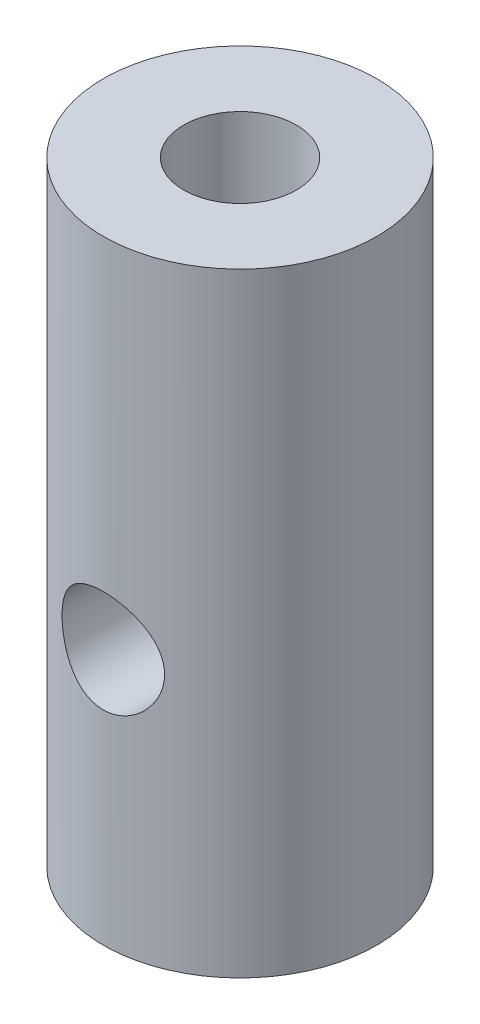
ISO-10303-21;
HEADER;
FILE_DESCRIPTION(('STEP AP214'),'2;1');
FILE_NAME('part.step','',(''),(''),'','','');
FILE_SCHEMA(('AUTOMOTIVE_DESIGN { 1 0 10303 214 1 1 1 1 }'));
ENDSEC;
DATA;
#1=APPLICATION_CONTEXT('core data for automotive mechanical design processes');
#2=APPLICATION_PROTOCOL_DEFINITION('international standard','automotive_design',2000,#1);
#3=PRODUCT_CONTEXT('',#1,'mechanical');
#4=PRODUCT('Part','Part','',(#3));
#5=PRODUCT_RELATED_PRODUCT_CATEGORY('part','',(#4));
#6=PRODUCT_DEFINITION_FORMATION('','',#4);
#7=PRODUCT_DEFINITION_CONTEXT('part definition',#1,'design');
#8=PRODUCT_DEFINITION('design','',#6,#7);
#9=PRODUCT_DEFINITION_SHAPE('','',#8);
#10=(LENGTH_UNIT() NAMED_UNIT(*) SI_UNIT(.MILLI.,.METRE.));
#11=(NAMED_UNIT(*) PLANE_ANGLE_UNIT() SI_UNIT($,.RADIAN.));
#12=(NAMED_UNIT(*) SI_UNIT($,.STERADIAN.) SOLID_ANGLE_UNIT());
#13=UNCERTAINTY_MEASURE_WITH_UNIT(LENGTH_MEASURE(1.E-05),#10,'distance_accuracy_value','');
#14=(GEOMETRIC_REPRESENTATION_CONTEXT(3) GLOBAL_UNCERTAINTY_ASSIGNED_CONTEXT((#13)) GLOBAL_UNIT_ASSIGNED_CONTEXT((#10,
#11,#12)) REPRESENTATION_CONTEXT('',''));
#15=CARTESIAN_POINT('',(0.,0.,0.));
#16=DIRECTION('',(0.,0.,1.));
#17=DIRECTION('',(1.,0.,0.));
#18=AXIS2_PLACEMENT_3D('',#15,#16,#17);
#19=CARTESIAN_POINT('',(0.,29.2787083669848,0.));
#20=DIRECTION('',(0.,-1.,0.));
#21=DIRECTION('',(0.,0.,-1.));
#22=AXIS2_PLACEMENT_3D('',#19,#20,#21);
#23=CYLINDRICAL_SURFACE('',#22,4.);
#24=CARTESIAN_POINT('',(0.,8.96500003999999,-4.));
#25=CARTESIAN_POINT('',(0.0812350589378522,8.9650029423031,-4.00000217456151));
#26=CARTESIAN_POINT('',(0.162450241781791,8.95838027975161,-3.99750379283184));
#27=CARTESIAN_POINT('',(0.322453452352359,8.93217184473006,-3.98778696006928));
#28=CARTESIAN_POINT('',(0.401241827987613,8.91258793952943,-3.98056918893993));
#29=CARTESIAN_POINT('',(0.554060784990875,8.86124703822823,-3.96218832391545));
#30=CARTESIAN_POINT('',(0.628100224162273,8.82951352317821,-3.9510328434944));
#31=CARTESIAN_POINT('',(0.769799310160249,8.75489362698417,-3.92588767765353));
#32=CARTESIAN_POINT('',(0.837457239177874,8.71200425445584,-3.91189723227548));
#33=CARTESIAN_POINT('',(0.96734641704582,8.61438750892909,-3.88186246971217));
#34=CARTESIAN_POINT('',(1.02927073015119,8.5592697777406,-3.86576002583566));
#35=CARTESIAN_POINT('',(1.14324421474363,8.43958960534116,-3.83360220871327));
#36=CARTESIAN_POINT('',(1.19529036359202,8.37502428391213,-3.81754685135033));
#37=CARTESIAN_POINT('',(1.28998202215984,8.23528257247679,-3.78662470617732));
#38=CARTESIAN_POINT('',(1.33219393195759,8.15979567345418,-3.77182648820819));
#39=CARTESIAN_POINT('',(1.40318646334084,8.00215168583148,-3.74599860237434));
#40=CARTESIAN_POINT('',(1.43197244961238,7.9199972768449,-3.73496742975881));
#41=CARTESIAN_POINT('',(1.47408431017549,7.7548832997418,-3.71854412824136));
#42=CARTESIAN_POINT('',(1.48799593218557,7.67209500156456,-3.71293924350838));
#43=CARTESIAN_POINT('',(1.50179556531647,7.50518388200616,-3.70738061461215));
#44=CARTESIAN_POINT('',(1.5016893680263,7.42106162612554,-3.70742453659305));
#45=CARTESIAN_POINT('',(1.48790429610018,7.25923051478705,-3.71297511632055));
#46=CARTESIAN_POINT('',(1.47503808509003,7.18143913395583,-3.71815468871122));
#47=CARTESIAN_POINT('',(1.4374416786833,7.02921288959469,-3.7328493805953));
#48=CARTESIAN_POINT('',(1.41270969663258,6.95477853338613,-3.74236515298863));
#49=CARTESIAN_POINT('',(1.35163748571904,6.80972297227178,-3.76485702190253));
#50=CARTESIAN_POINT('',(1.315086487371,6.73920055387871,-3.77789517988166));
#51=CARTESIAN_POINT('',(1.23156073762698,6.60505430240904,-3.80594210139319));
#52=CARTESIAN_POINT('',(1.18458238728897,6.54143286248031,-3.82095154457158));
#53=CARTESIAN_POINT('',(1.07781780766549,6.41839637634914,-3.85248038859113));
#54=CARTESIAN_POINT('',(1.01738298716956,6.35955139925192,-3.8690334745567));
#55=CARTESIAN_POINT('',(0.887312590819025,6.25266207379422,-3.90091728164085));
#56=CARTESIAN_POINT('',(0.817675603497369,6.20461938539434,-3.91624781465952));
#57=CARTESIAN_POINT('',(0.669723436992426,6.12006964293749,-3.9442639480908));
#58=CARTESIAN_POINT('',(0.591290713844726,6.08375245877895,-3.95690498259616));
#59=CARTESIAN_POINT('',(0.428836850524591,6.02501743572997,-3.97778718326962));
#60=CARTESIAN_POINT('',(0.344818210845776,6.0025934234389,-3.98603030341493));
#61=CARTESIAN_POINT('',(0.178375243148675,5.97337725245808,-3.99684443228065));
#62=CARTESIAN_POINT('',(0.0961036195622195,5.9658174336175,-3.99969369025686));
#63=CARTESIAN_POINT('',(-0.0685724752550129,5.96430897610009,-4.00025893700126));
#64=CARTESIAN_POINT('',(-0.150976912983361,5.97035731968324,-3.99797606386863));
#65=CARTESIAN_POINT('',(-0.310262048561847,5.99531008230868,-3.98871709772643));
#66=CARTESIAN_POINT('',(-0.387233328007323,6.0137115837371,-3.98192470962305));
#67=CARTESIAN_POINT('',(-0.536941754957207,6.06218611254733,-3.96451477091717));
#68=CARTESIAN_POINT('',(-0.60967835034752,6.09226065794805,-3.9538967228203));
#69=CARTESIAN_POINT('',(-0.751247765110141,6.16418645243948,-3.92949624407682));
#70=CARTESIAN_POINT('',(-0.81990308355778,6.20635776922339,-3.91563000209349));
#71=CARTESIAN_POINT('',(-0.94939271172661,6.30091814317157,-3.88626671564664));
#72=CARTESIAN_POINT('',(-1.01022412027043,6.35331097254516,-3.87076907009516));
#73=CARTESIAN_POINT('',(-1.12603079874453,6.47040416212428,-3.8387332949099));
#74=CARTESIAN_POINT('',(-1.18046154123567,6.5356422227727,-3.8221869650373));
#75=CARTESIAN_POINT('',(-1.27771050031902,6.67465142470766,-3.79078815746854));
#76=CARTESIAN_POINT('',(-1.32052767414517,6.7484233313885,-3.775935831944));
#77=CARTESIAN_POINT('',(-1.39337773518996,6.90301602677232,-3.74966829822464));
#78=CARTESIAN_POINT('',(-1.42335685446916,6.98386478591044,-3.73826760328494));
#79=CARTESIAN_POINT('',(-1.46907883466887,7.15000980368782,-3.72054032891006));
#80=CARTESIAN_POINT('',(-1.48483050305533,7.23530327619812,-3.71421061057491));
#81=CARTESIAN_POINT('',(-1.50086347097837,7.40201619954111,-3.70775894792574));
#82=CARTESIAN_POINT('',(-1.50207331495836,7.48333267171688,-3.70726444523342));
#83=CARTESIAN_POINT('',(-1.49136715641591,7.64494535627616,-3.71158412745293));
#84=CARTESIAN_POINT('',(-1.47945239850122,7.72524166467158,-3.71639780898899));
#85=CARTESIAN_POINT('',(-1.4435581563024,7.88004726671655,-3.73048141585433));
#86=CARTESIAN_POINT('',(-1.41995798316523,7.95465838624534,-3.73961085376664));
#87=CARTESIAN_POINT('',(-1.36169696779918,8.09890554849441,-3.76121548297845));
#88=CARTESIAN_POINT('',(-1.32703332944943,8.16854032807013,-3.77369151995215));
#89=CARTESIAN_POINT('',(-1.24552075938152,8.30482682969762,-3.80139723903965));
#90=CARTESIAN_POINT('',(-1.19812832803009,8.3711308367999,-3.81673698440965));
#91=CARTESIAN_POINT('',(-1.09334485729905,8.4951416009712,-3.84806246757178));
#92=CARTESIAN_POINT('',(-1.03595064012807,8.55284561478675,-3.86404840943145));
#93=CARTESIAN_POINT('',(-0.909080396784612,8.66120199582183,-3.89590424609881));
#94=CARTESIAN_POINT('',(-0.839118644212982,8.71130379343466,-3.91172104900645));
#95=CARTESIAN_POINT('',(-0.691213223200812,8.79902269527655,-3.94054514457031));
#96=CARTESIAN_POINT('',(-0.613268934090613,8.83663882773636,-3.95355221851559));
#97=CARTESIAN_POINT('',(-0.447999082002306,8.89937686904832,-3.9757429260668));
#98=CARTESIAN_POINT('',(-0.360413422234203,8.92388710460189,-3.98473657158356));
#99=CARTESIAN_POINT('',(-0.18187573360638,8.95669299992067,-3.99686242179587));
#100=CARTESIAN_POINT('',(-0.0909254163648577,8.96499679148731,-3.99999756603967));
#101=CARTESIAN_POINT('',(0.,8.96500003999999,-4.));
#102=B_SPLINE_CURVE_WITH_KNOTS('',3,(#24,#25,#26,#27,#28,#29,#30,#31,#32,#33,#34,#35,#36,#37,
#38,#39,#40,#41,#42,#43,#44,#45,#46,#47,#48,#49,#50,#51,#52,#53,#54,#55,#56,#57,#58,#59,#60,#61,
#62,#63,#64,#65,#66,#67,#68,#69,#70,#71,#72,#73,#74,#75,#76,#77,#78,#79,#80,#81,#82,#83,#84,#85,
#86,#87,#88,#89,#90,#91,#92,#93,#94,#95,#96,#97,#98,#99,#100,#101),.UNSPECIFIED.,.T.,.F.,(4,2,2,
2,2,2,2,2,2,2,2,2,2,2,2,2,2,2,2,2,2,2,2,2,2,2,2,2,2,2,2,2,2,2,2,2,2,2,4),(0.,0.243369801560558,
0.486704549530457,0.729571369213568,0.972503379609483,1.22473618582715,1.47704604925621,
1.73896674501657,2.00078269352132,2.251858744169,2.50283106079705,2.73878345119969,
2.97477138060587,3.21522408387016,3.45575990744256,3.7124615333581,3.96920257905063,
4.22991375286072,4.49050899698842,4.73725019635922,4.98393668390517,5.22114437923836,
5.4583829325445,5.70259221859596,5.94689180019864,6.20536519455653,6.46386178920136,
6.72343066727199,6.98283874956502,7.22558763480247,7.46831350211253,7.70363142426528,
7.93900886656501,8.18672471884265,8.43451941997056,8.69572329654033,8.95694749805095,
9.22948515032035,9.5018860179612),.UNSPECIFIED.);
#103=CARTESIAN_POINT('',(0.,8.96500003999999,-4.));
#104=VERTEX_POINT('',#103);
#105=EDGE_CURVE('E43',#104,#104,#102,.T.);
#106=ORIENTED_EDGE('',*,*,#105,.F.);
#107=EDGE_LOOP('',(#106));
#108=FACE_BOUND('',#107,.T.);
#109=CARTESIAN_POINT('',(1.5,7.46500004,3.70809924354783));
#110=CARTESIAN_POINT('',(1.50000304106109,7.54600752372079,3.70809640633806));
#111=CARTESIAN_POINT('',(1.49341597549487,7.62699496250364,3.71078260240986));
#112=CARTESIAN_POINT('',(1.46736187895467,7.7865281229132,3.72116159304967));
#113=CARTESIAN_POINT('',(1.44789523373263,7.86507391759501,3.72885423767112));
#114=CARTESIAN_POINT('',(1.39689657610573,8.01737541161352,3.748254802809));
#115=CARTESIAN_POINT('',(1.36539347266348,8.09114209665108,3.7599530956926));
#116=CARTESIAN_POINT('',(1.29131856742697,8.23237193681884,3.78603134206598));
#117=CARTESIAN_POINT('',(1.24874344095038,8.29983319028252,3.80041210067323));
#118=CARTESIAN_POINT('',(1.15146661374162,8.42989035162281,3.83103574665713));
#119=CARTESIAN_POINT('',(1.09630381213306,8.49212856962939,3.84733341923604));
#120=CARTESIAN_POINT('',(0.976395839778924,8.60672285467148,3.87949750628547));
#121=CARTESIAN_POINT('',(0.911648630256679,8.65907681374185,3.89536382814785));
#122=CARTESIAN_POINT('',(0.7716946551776,8.75413955229561,3.92552873936553));
#123=CARTESIAN_POINT('',(0.696206947538028,8.79645951471585,3.93975561223505));
#124=CARTESIAN_POINT('',(0.538555771965248,8.8676512125249,3.96438007973848));
#125=CARTESIAN_POINT('',(0.456394630933537,8.89652761199197,3.97477900217006));
#126=CARTESIAN_POINT('',(0.291489341676834,8.93875793577461,3.9901869710344));
#127=CARTESIAN_POINT('',(0.208923197281599,8.95272766744045,3.99540915214774));
#128=CARTESIAN_POINT('',(0.0424643637947895,8.96672124094498,4.0006401410794));
#129=CARTESIAN_POINT('',(-0.0414278850628287,8.9667496176187,4.00065064414902));
#130=CARTESIAN_POINT('',(-0.20374354306447,8.95321827853482,3.99559265903894));
#131=CARTESIAN_POINT('',(-0.282232178266893,8.94033074205118,3.99077541996683));
#132=CARTESIAN_POINT('',(-0.435839217984384,8.90246412477444,3.97693274932263));
#133=CARTESIAN_POINT('',(-0.510957383430291,8.87748418773795,3.96790701975578));
#134=CARTESIAN_POINT('',(-0.656989017303096,8.81582958832415,3.94637769167531));
#135=CARTESIAN_POINT('',(-0.7278253922873,8.77899003473158,3.93382539470077));
#136=CARTESIAN_POINT('',(-0.862486607957549,8.6948079430706,3.90651310225279));
#137=CARTESIAN_POINT('',(-0.926309176932312,8.64746201698239,3.8917523951284));
#138=CARTESIAN_POINT('',(-1.04909048680092,8.54037275371681,3.86052529655817));
#139=CARTESIAN_POINT('',(-1.10754614526347,8.48006612434957,3.84400963763883));
#140=CARTESIAN_POINT('',(-1.21370395569341,8.35040704667843,3.81182460645722));
#141=CARTESIAN_POINT('',(-1.26140340692898,8.28105233341335,3.79615544748848));
#142=CARTESIAN_POINT('',(-1.3456561180815,8.13328057253717,3.76712703500336));
#143=CARTESIAN_POINT('',(-1.38193847851829,8.05469654631393,3.75382677150277));
#144=CARTESIAN_POINT('',(-1.440564644415,7.89190381483242,3.73172438629003));
#145=CARTESIAN_POINT('',(-1.46291620605593,7.80769826840631,3.72291976205784));
#146=CARTESIAN_POINT('',(-1.49190191709667,7.64102407768404,3.71139597222849));
#147=CARTESIAN_POINT('',(-1.49933521158964,7.55871593446386,3.70836785241538));
#148=CARTESIAN_POINT('',(-1.5005788563627,7.39399068325826,3.70786539525016));
#149=CARTESIAN_POINT('',(-1.4943926109376,7.31157360764753,3.71038967003987));
#150=CARTESIAN_POINT('',(-1.46929733520155,7.15307011771232,3.72039381629736));
#151=CARTESIAN_POINT('',(-1.45100618334223,7.07686890423534,3.72763276216449));
#152=CARTESIAN_POINT('',(-1.40299774640636,6.92865209527981,3.74596487046362));
#153=CARTESIAN_POINT('',(-1.37327812034621,6.85663736083187,3.75705882250173));
#154=CARTESIAN_POINT('',(-1.30200292275276,6.7158356019238,3.7823624311608));
#155=CARTESIAN_POINT('',(-1.26004545177045,6.64727074786267,3.79667328892066));
#156=CARTESIAN_POINT('',(-1.16591317862477,6.51787105827397,3.82662814294292));
#157=CARTESIAN_POINT('',(-1.11373463696433,6.45703906537537,3.84227262594077));
#158=CARTESIAN_POINT('',(-0.996727340900921,6.34083166680491,3.87433046553184));
#159=CARTESIAN_POINT('',(-0.931306341491045,6.28604663123126,3.89072969357028));
#160=CARTESIAN_POINT('',(-0.791797471753135,6.18816167241057,3.92149874963302));
#161=CARTESIAN_POINT('',(-0.717709573322658,6.14506178705417,3.93586857107664));
#162=CARTESIAN_POINT('',(-0.563016329468463,6.0720539838004,3.96094985704552));
#163=CARTESIAN_POINT('',(-0.482434433064614,6.04210091620741,3.9716738133801));
#164=CARTESIAN_POINT('',(-0.316881887523243,5.99634362615009,3.98829436712571));
#165=CARTESIAN_POINT('',(-0.231913320723582,5.98053275457761,3.99419323299413));
#166=CARTESIAN_POINT('',(-0.0653355852738057,5.96422563724519,4.00028407317073));
#167=CARTESIAN_POINT('',(0.0161807680608545,5.96289055694102,4.00078860953764));
#168=CARTESIAN_POINT('',(0.178226786412432,5.97341519944541,3.99684889809223));
#169=CARTESIAN_POINT('',(0.258756569245264,5.98527333088587,3.9924052471313));
#170=CARTESIAN_POINT('',(0.414548248377132,6.02125889149363,3.97921089603771));
#171=CARTESIAN_POINT('',(0.48989073106884,6.04507994587837,3.97056791378017));
#172=CARTESIAN_POINT('',(0.635515473006394,6.10401005338438,3.9498778362099));
#173=CARTESIAN_POINT('',(0.705796771275547,6.13912124330477,3.93783009655664));
#174=CARTESIAN_POINT('',(0.842540176994416,6.22131398350482,3.91090618300074));
#175=CARTESIAN_POINT('',(0.908717548846852,6.26883668051416,3.89593240108828));
#176=CARTESIAN_POINT('',(1.03241734752336,6.37380787018762,3.86499507694844));
#177=CARTESIAN_POINT('',(1.0899366712559,6.43125990580789,3.84903118274027));
#178=CARTESIAN_POINT('',(1.19781214236196,6.55806417164507,3.81688129739175));
#179=CARTESIAN_POINT('',(1.24762999816025,6.62788444215432,3.8007280534916));
#180=CARTESIAN_POINT('',(1.33484709556843,6.77541590957334,3.77098325003638));
#181=CARTESIAN_POINT('',(1.37224504878157,6.85312792405349,3.75739195631217));
#182=CARTESIAN_POINT('',(1.4346588697426,7.01795572097541,3.73402269853266));
#183=CARTESIAN_POINT('',(1.45906002899522,7.10533440651179,3.7244380329086));
#184=CARTESIAN_POINT('',(1.49172356722079,7.28348531195579,3.71147994336316));
#185=CARTESIAN_POINT('',(1.4999965933957,7.37425525271,3.70810242179736));
#186=CARTESIAN_POINT('',(1.5,7.46500004,3.70809924354783));
#187=B_SPLINE_CURVE_WITH_KNOTS('',3,(#109,#110,#111,#112,#113,#114,#115,#116,#117,#118,#119,
#120,#121,#122,#123,#124,#125,#126,#127,#128,#129,#130,#131,#132,#133,#134,#135,#136,#137,#138,
#139,#140,#141,#142,#143,#144,#145,#146,#147,#148,#149,#150,#151,#152,#153,#154,#155,#156,#157,
#158,#159,#160,#161,#162,#163,#164,#165,#166,#167,#168,#169,#170,#171,#172,#173,#174,#175,#176,
#177,#178,#179,#180,#181,#182,#183,#184,#185,#186),.UNSPECIFIED.,.T.,.F.,(4,2,2,2,2,2,2,2,2,2,2,
2,2,2,2,2,2,2,2,2,2,2,2,2,2,2,2,2,2,2,2,2,2,2,2,2,2,2,4),(0.,0.242684541416168,
0.485361814598851,0.727459856757024,0.969630679682928,1.22274652401127,1.47591628822982,
1.7377007213642,1.99939426381329,2.24980018489678,2.50012465404856,2.73806472803192,
2.97602165263333,3.21744131210666,3.45893893628973,3.71456675065872,3.97025867827332,
4.23162592252963,4.49284751635471,4.73965657740482,4.98640395388881,5.22143845928195,
5.45652113429522,5.70041561005817,5.94439948466351,6.2038501699362,6.46330169650173,
6.72185508890164,6.98028685560122,7.22365720549931,7.46699820319474,7.70440274003885,
7.94185223512825,8.18928323676981,8.43680270894959,8.69738599542073,8.95799630544236,
9.2300317887092,9.50188762323046),.UNSPECIFIED.);
#188=CARTESIAN_POINT('',(1.5,7.46500004,3.70809924354783));
#189=VERTEX_POINT('',#188);
#190=EDGE_CURVE('E11',#189,#189,#187,.T.);
#191=ORIENTED_EDGE('',*,*,#190,.F.);
#192=EDGE_LOOP('',(#191));
#193=FACE_BOUND('',#192,.T.);
#194=CARTESIAN_POINT('',(0.,17.964999868,0.));
#195=DIRECTION('',(0.,-1.,0.));
#196=DIRECTION('',(0.,0.,-1.));
#197=AXIS2_PLACEMENT_3D('',#194,#195,#196);
#198=CIRCLE('',#197,4.);
#199=CARTESIAN_POINT('',(0.,17.964999868,-4.));
#200=VERTEX_POINT('',#199);
#201=EDGE_CURVE('E50',#200,#200,#198,.F.);
#202=ORIENTED_EDGE('',*,*,#201,.F.);
#203=EDGE_LOOP('',(#202));
#204=FACE_BOUND('',#203,.T.);
#205=CARTESIAN_POINT('',(0.,0.,0.));
#206=DIRECTION('',(0.,-1.,0.));
#207=DIRECTION('',(0.,0.,-1.));
#208=AXIS2_PLACEMENT_3D('',#205,#206,#207);
#209=CIRCLE('',#208,4.);
#210=CARTESIAN_POINT('',(0.,0.,-4.));
#211=VERTEX_POINT('',#210);
#212=EDGE_CURVE('E66',#211,#211,#209,.T.);
#213=ORIENTED_EDGE('',*,*,#212,.F.);
#214=EDGE_LOOP('',(#213));
#215=FACE_BOUND('',#214,.T.);
#216=ADVANCED_FACE('F39',(#108,#193,#204,#215),#23,.T.);
#217=CARTESIAN_POINT('',(0.,0.,0.));
#218=DIRECTION('',(0.,-1.,0.));
#219=DIRECTION('',(0.,0.,-1.));
#220=AXIS2_PLACEMENT_3D('',#217,#218,#219);
#221=PLANE('',#220);
#222=ORIENTED_EDGE('',*,*,#212,.T.);
#223=EDGE_LOOP('',(#222));
#224=FACE_BOUND('',#223,.T.);
#225=ADVANCED_FACE('F83',(#224),#221,.T.);
#226=CARTESIAN_POINT('',(0.,17.964999868,0.));
#227=DIRECTION('',(0.,-1.,0.));
#228=DIRECTION('',(1.,0.,0.));
#229=AXIS2_PLACEMENT_3D('',#226,#227,#228);
#230=PLANE('',#229);
#231=CARTESIAN_POINT('',(0.,17.964999868,0.));
#232=DIRECTION('',(0.,1.,0.));
#233=DIRECTION('',(0.,0.,1.));
#234=AXIS2_PLACEMENT_3D('',#231,#232,#233);
#235=CIRCLE('',#234,1.64999999999999);
#236=CARTESIAN_POINT('',(0.,17.964999868,1.64999999999999));
#237=VERTEX_POINT('',#236);
#238=EDGE_CURVE('E63',#237,#237,#235,.T.);
#239=ORIENTED_EDGE('',*,*,#238,.F.);
#240=EDGE_LOOP('',(#239));
#241=FACE_BOUND('',#240,.T.);
#242=ORIENTED_EDGE('',*,*,#201,.T.);
#243=EDGE_LOOP('',(#242));
#244=FACE_BOUND('',#243,.T.);
#245=ADVANCED_FACE('F78',(#241,#244),#230,.F.);
#246=CARTESIAN_POINT('',(0.,7.46500004,4.));
#247=DIRECTION('',(0.,0.,1.));
#248=DIRECTION('',(1.,0.,0.));
#249=AXIS2_PLACEMENT_3D('',#246,#247,#248);
#250=CYLINDRICAL_SURFACE('',#249,1.49999999999999);
#251=ORIENTED_EDGE('',*,*,#105,.T.);
#252=EDGE_LOOP('',(#251));
#253=FACE_BOUND('',#252,.T.);
#254=ORIENTED_EDGE('',*,*,#190,.T.);
#255=EDGE_LOOP('',(#254));
#256=FACE_BOUND('',#255,.T.);
#257=ADVANCED_FACE('F57',(#253,#256),#250,.F.);
#258=CARTESIAN_POINT('',(0.,10.852999868,0.));
#259=DIRECTION('',(0.,1.,0.));
#260=DIRECTION('',(0.,0.,1.));
#261=AXIS2_PLACEMENT_3D('',#258,#259,#260);
#262=CONICAL_SURFACE('',#261,1.65,1.02974425867665);
#263=CARTESIAN_POINT('',(0.,9.86157984660452,0.));
#264=VERTEX_POINT('',#263);
#265=VERTEX_LOOP('',#264);
#266=FACE_BOUND('',#265,.T.);
#267=CARTESIAN_POINT('',(0.,10.852999868,0.));
#268=DIRECTION('',(0.,1.,0.));
#269=DIRECTION('',(0.,0.,1.));
#270=AXIS2_PLACEMENT_3D('',#267,#268,#269);
#271=CIRCLE('',#270,1.65);
#272=CARTESIAN_POINT('',(0.,10.852999868,1.65));
#273=VERTEX_POINT('',#272);
#274=EDGE_CURVE('E61',#273,#273,#271,.T.);
#275=ORIENTED_EDGE('',*,*,#274,.T.);
#276=EDGE_LOOP('',(#275));
#277=FACE_BOUND('',#276,.T.);
#278=ADVANCED_FACE('F53',(#266,#277),#262,.F.);
#279=CARTESIAN_POINT('',(0.,17.964999868,0.));
#280=DIRECTION('',(0.,1.,0.));
#281=DIRECTION('',(0.,0.,1.));
#282=AXIS2_PLACEMENT_3D('',#279,#280,#281);
#283=CYLINDRICAL_SURFACE('',#282,1.64999999999999);
#284=ORIENTED_EDGE('',*,*,#274,.F.);
#285=EDGE_LOOP('',(#284));
#286=FACE_BOUND('',#285,.T.);
#287=ORIENTED_EDGE('',*,*,#238,.T.);
#288=EDGE_LOOP('',(#287));
#289=FACE_BOUND('',#288,.T.);
#290=ADVANCED_FACE('F56',(#286,#289),#283,.F.);
#291=CLOSED_SHELL('',(#216,#225,#245,#257,#278,#290));
#292=MANIFOLD_SOLID_BREP('B2',#291);
#293=ADVANCED_BREP_SHAPE_REPRESENTATION('',(#18,#292),#14);
#294=SHAPE_DEFINITION_REPRESENTATION(#9,#293);
ENDSEC;
END-ISO-10303-21;
